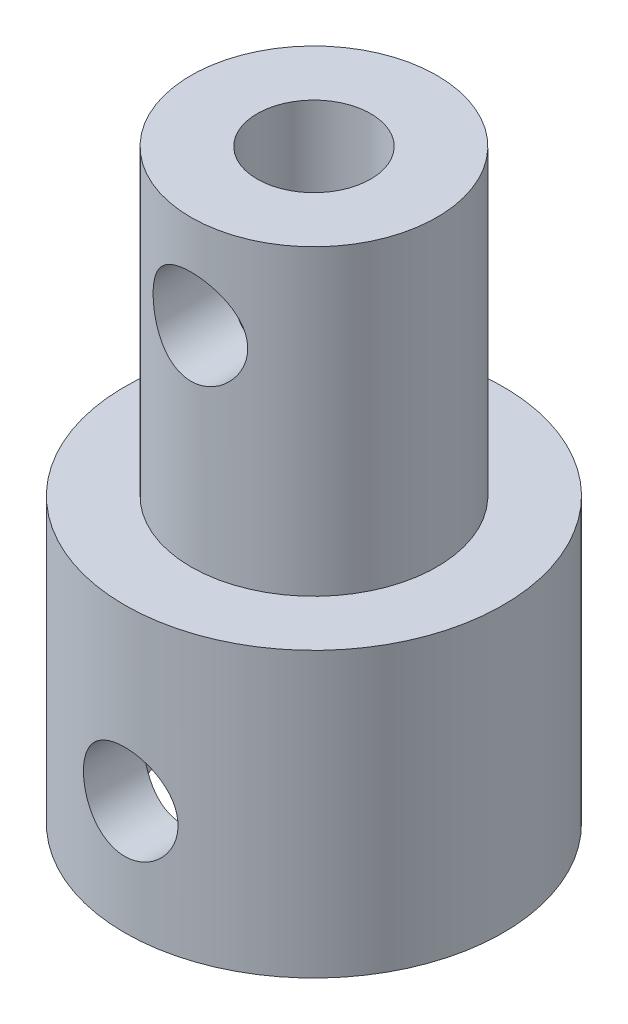
ISO-10303-21;
HEADER;
FILE_DESCRIPTION(('STEP AP214'),'2;1');
FILE_NAME('part.step','',(''),(''),'','','');
FILE_SCHEMA(('AUTOMOTIVE_DESIGN { 1 0 10303 214 1 1 1 1 }'));
ENDSEC;
DATA;
#1=APPLICATION_CONTEXT('core data for automotive mechanical design processes');
#2=APPLICATION_PROTOCOL_DEFINITION('international standard','automotive_design',2000,#1);
#3=PRODUCT_CONTEXT('',#1,'mechanical');
#4=PRODUCT('Part','Part','',(#3));
#5=PRODUCT_RELATED_PRODUCT_CATEGORY('part','',(#4));
#6=PRODUCT_DEFINITION_FORMATION('','',#4);
#7=PRODUCT_DEFINITION_CONTEXT('part definition',#1,'design');
#8=PRODUCT_DEFINITION('design','',#6,#7);
#9=PRODUCT_DEFINITION_SHAPE('','',#8);
#10=(LENGTH_UNIT() NAMED_UNIT(*) SI_UNIT(.MILLI.,.METRE.));
#11=(NAMED_UNIT(*) PLANE_ANGLE_UNIT() SI_UNIT($,.RADIAN.));
#12=(NAMED_UNIT(*) SI_UNIT($,.STERADIAN.) SOLID_ANGLE_UNIT());
#13=UNCERTAINTY_MEASURE_WITH_UNIT(LENGTH_MEASURE(1.E-05),#10,'distance_accuracy_value','');
#14=(GEOMETRIC_REPRESENTATION_CONTEXT(3) GLOBAL_UNCERTAINTY_ASSIGNED_CONTEXT((#13)) GLOBAL_UNIT_ASSIGNED_CONTEXT((#10,
#11,#12)) REPRESENTATION_CONTEXT('',''));
#15=CARTESIAN_POINT('',(0.,0.,0.));
#16=DIRECTION('',(0.,0.,1.));
#17=DIRECTION('',(1.,0.,0.));
#18=AXIS2_PLACEMENT_3D('',#15,#16,#17);
#19=CARTESIAN_POINT('',(0.,39.5299075629112,0.));
#20=DIRECTION('',(0.,1.,0.));
#21=DIRECTION('',(0.,0.,1.));
#22=AXIS2_PLACEMENT_3D('',#19,#20,#21);
#23=CYLINDRICAL_SURFACE('',#22,6.5);
#24=CARTESIAN_POINT('',(0.,23.5,6.5));
#25=CARTESIAN_POINT('',(0.13514306397447,23.4999939273656,6.50000462986299));
#26=CARTESIAN_POINT('',(0.270245683690177,23.5109920103322,6.49574921829707));
#27=CARTESIAN_POINT('',(0.536399893676354,23.5545046796923,6.47920060501405));
#28=CARTESIAN_POINT('',(0.667452289329329,23.5870149592184,6.46690901219325));
#29=CARTESIAN_POINT('',(0.921628003225198,23.6722230931575,6.43560329326637));
#30=CARTESIAN_POINT('',(1.04476653465277,23.7248807736205,6.41660255099367));
#31=CARTESIAN_POINT('',(1.2804490890132,23.8486790867224,6.3737599269311));
#32=CARTESIAN_POINT('',(1.39299010958969,23.919824935867,6.34991667922571));
#33=CARTESIAN_POINT('',(1.60927258674543,24.0818695715037,6.29865787982818));
#34=CARTESIAN_POINT('',(1.71248272971103,24.1734440616638,6.27113765392606));
#35=CARTESIAN_POINT('',(1.90251373412528,24.3723120888079,6.21612788263757));
#36=CARTESIAN_POINT('',(1.98932919333356,24.4796107864902,6.18863835032093));
#37=CARTESIAN_POINT('',(2.1475734167864,24.7121749791886,6.13556746669897));
#38=CARTESIAN_POINT('',(2.21823663101441,24.8379921285933,6.11010848455125));
#39=CARTESIAN_POINT('',(2.33716189177336,25.1008566598219,6.06561918541038));
#40=CARTESIAN_POINT('',(2.38543341568331,25.2378992614743,6.04658614953798));
#41=CARTESIAN_POINT('',(2.45608262902036,25.513196736226,6.01822730812514));
#42=CARTESIAN_POINT('',(2.47947801200991,25.6511499533078,6.00852169181304));
#43=CARTESIAN_POINT('',(2.50289199475193,25.929339459977,5.99880894830526));
#44=CARTESIAN_POINT('',(2.50292090442515,26.0695747153534,5.99879754376073));
#45=CARTESIAN_POINT('',(2.48037656312943,26.3388642581518,6.00814837573631));
#46=CARTESIAN_POINT('',(2.45923795706445,26.4680632129148,6.01691562933088));
#47=CARTESIAN_POINT('',(2.39733806133433,26.7209150794066,6.04184340382832));
#48=CARTESIAN_POINT('',(2.35657365742926,26.8445671075386,6.05800509806771));
#49=CARTESIAN_POINT('',(2.25582663922901,27.0856583117823,6.09624370169108));
#50=CARTESIAN_POINT('',(2.19548450476653,27.2029291522169,6.1184298919496));
#51=CARTESIAN_POINT('',(2.05754611602823,27.4260878785016,6.16618367671209));
#52=CARTESIAN_POINT('',(1.97994369235949,27.5319716741229,6.19175247894498));
#53=CARTESIAN_POINT('',(1.80320515332932,27.7372591612457,6.24560345180462));
#54=CARTESIAN_POINT('',(1.70293144449403,27.83566921961,6.27394938839792));
#55=CARTESIAN_POINT('',(1.48698639045576,28.0145806692834,6.32860686825818));
#56=CARTESIAN_POINT('',(1.37131243202998,28.0950790150006,6.35491806505566));
#57=CARTESIAN_POINT('',(1.12520910755081,28.2370550482149,6.40311406732309));
#58=CARTESIAN_POINT('',(0.994562099156593,28.2981856575932,6.42491590699446));
#59=CARTESIAN_POINT('',(0.723789666413503,28.3972661025489,6.46101701436));
#60=CARTESIAN_POINT('',(0.583668713964962,28.4352267911306,6.47531979423949));
#61=CARTESIAN_POINT('',(0.306275874042355,28.4849421817623,6.49418523125042));
#62=CARTESIAN_POINT('',(0.169277177253719,28.4980338789584,6.49924422048433));
#63=CARTESIAN_POINT('',(-0.105038056069671,28.5015534380367,6.50059706095231));
#64=CARTESIAN_POINT('',(-0.242354510117281,28.491986638772,6.49689297696437));
#65=CARTESIAN_POINT('',(-0.507523391484589,28.4514649156598,6.48146252652959));
#66=CARTESIAN_POINT('',(-0.635533278632624,28.4213996939687,6.47007006377642));
#67=CARTESIAN_POINT('',(-0.884591112419541,28.3419207694987,6.44074795216429));
#68=CARTESIAN_POINT('',(-1.00563815383339,28.2925045574291,6.42281745552311));
#69=CARTESIAN_POINT('',(-1.24139762727352,28.1741323847667,6.38151162872812));
#70=CARTESIAN_POINT('',(-1.35581229097728,28.1046361856224,6.35798948099243));
#71=CARTESIAN_POINT('',(-1.57174720946057,27.9486828718725,6.30808313000719));
#72=CARTESIAN_POINT('',(-1.67326251243973,27.8622192760433,6.28169783481671));
#73=CARTESIAN_POINT('',(-1.86700866345895,27.6685802493167,6.22695982329862));
#74=CARTESIAN_POINT('',(-1.95829399903938,27.5604624610308,6.19858535620119));
#75=CARTESIAN_POINT('',(-2.12162980756564,27.329904597358,6.14459987855306));
#76=CARTESIAN_POINT('',(-2.19367804771027,27.2074628617964,6.11898918899244));
#77=CARTESIAN_POINT('',(-2.31670165885943,26.950423952603,6.07348698871133));
#78=CARTESIAN_POINT('',(-2.3675457507259,26.8157571607653,6.05363133271636));
#79=CARTESIAN_POINT('',(-2.44547862786551,26.5387893944966,6.02257652756719));
#80=CARTESIAN_POINT('',(-2.47258316364822,26.39649354834,6.01137163946424));
#81=CARTESIAN_POINT('',(-2.50082210532946,26.1186113991318,5.99967502686126));
#82=CARTESIAN_POINT('',(-2.50357962943262,25.9832169809304,5.99851384313484));
#83=CARTESIAN_POINT('',(-2.48724412852083,25.7139989075653,6.00530547478505));
#84=CARTESIAN_POINT('',(-2.4681534084365,25.5801750882123,6.01325732876099));
#85=CARTESIAN_POINT('',(-2.40995136741684,25.3225039371973,6.03680892276013));
#86=CARTESIAN_POINT('',(-2.37153828396776,25.1984722976881,6.05214118297217));
#87=CARTESIAN_POINT('',(-2.27641115159597,24.9585502065407,6.08855756315716));
#88=CARTESIAN_POINT('',(-2.21969236739861,24.8426618708484,6.10964317117389));
#89=CARTESIAN_POINT('',(-2.08599319505101,24.6154646964258,6.15661478314378));
#90=CARTESIAN_POINT('',(-2.00807939428014,24.5047467585243,6.18269935662048));
#91=CARTESIAN_POINT('',(-1.83561573990325,24.297440282091,6.23607706100414));
#92=CARTESIAN_POINT('',(-1.74106046198838,24.2008563694186,6.2633705837922));
#93=CARTESIAN_POINT('',(-1.53143830219016,24.018824624031,6.31799605166972));
#94=CARTESIAN_POINT('',(-1.41549882935314,23.9343499410604,6.34523808084888));
#95=CARTESIAN_POINT('',(-1.17010716237062,23.7860891403572,6.39503827616325));
#96=CARTESIAN_POINT('',(-1.04065270472818,23.7223064955093,6.41759565581366));
#97=CARTESIAN_POINT('',(-0.762900842232426,23.6142955809813,6.4566913943766));
#98=CARTESIAN_POINT('',(-0.613925037531382,23.571615623945,6.47274070554298));
#99=CARTESIAN_POINT('',(-0.309946097844234,23.5144793950754,6.49438936244195));
#100=CARTESIAN_POINT('',(-0.154946466000343,23.5000069624975,6.49999469169273));
#101=CARTESIAN_POINT('',(0.,23.5,6.5));
#102=B_SPLINE_CURVE_WITH_KNOTS('',3,(#24,#25,#26,#27,#28,#29,#30,#31,#32,#33,#34,#35,#36,#37,
#38,#39,#40,#41,#42,#43,#44,#45,#46,#47,#48,#49,#50,#51,#52,#53,#54,#55,#56,#57,#58,#59,#60,#61,
#62,#63,#64,#65,#66,#67,#68,#69,#70,#71,#72,#73,#74,#75,#76,#77,#78,#79,#80,#81,#82,#83,#84,#85,
#86,#87,#88,#89,#90,#91,#92,#93,#94,#95,#96,#97,#98,#99,#100,#101),.UNSPECIFIED.,.T.,.F.,(4,2,2,
2,2,2,2,2,2,2,2,2,2,2,2,2,2,2,2,2,2,2,2,2,2,2,2,2,2,2,2,2,2,2,2,2,2,2,4),(0.,0.404857395673176,
0.809633761045265,1.21360717298343,1.61769469151935,2.03792903302865,2.45830160597867,
2.89569907712732,3.33291124861788,3.75145366078395,4.1698114006033,4.5616122308849,
4.95347525299001,5.35298551114874,5.75263879750162,6.18066348321892,6.60876089197113,
7.04414506400743,7.47932514126755,7.89036278979611,8.30130359821625,8.69545686414668,
9.08966125783836,9.49565660960558,9.90180734683232,10.3327599285418,10.7637625081092,
11.1973952581664,11.6307400870074,12.0349578310578,12.4391329351611,12.8296520191847,
13.2202722028207,13.6321153154032,14.0440929181879,14.480008517899,14.9159972424678,
15.3804472276237,15.8446310403091),.UNSPECIFIED.);
#103=CARTESIAN_POINT('',(0.,23.5,6.5));
#104=VERTEX_POINT('',#103);
#105=EDGE_CURVE('E79',#104,#104,#102,.T.);
#106=ORIENTED_EDGE('',*,*,#105,.F.);
#107=EDGE_LOOP('',(#106));
#108=FACE_BOUND('',#107,.T.);
#109=CARTESIAN_POINT('',(0.,15.,0.));
#110=DIRECTION('',(0.,1.,0.));
#111=DIRECTION('',(0.,0.,1.));
#112=AXIS2_PLACEMENT_3D('',#109,#110,#111);
#113=CIRCLE('',#112,6.5);
#114=CARTESIAN_POINT('',(0.,15.,6.5));
#115=VERTEX_POINT('',#114);
#116=EDGE_CURVE('E69',#115,#115,#113,.T.);
#117=ORIENTED_EDGE('',*,*,#116,.T.);
#118=EDGE_LOOP('',(#117));
#119=FACE_BOUND('',#118,.T.);
#120=CARTESIAN_POINT('',(0.,31.,0.));
#121=DIRECTION('',(0.,1.,0.));
#122=DIRECTION('',(0.,0.,1.));
#123=AXIS2_PLACEMENT_3D('',#120,#121,#122);
#124=CIRCLE('',#123,6.5);
#125=CARTESIAN_POINT('',(0.,31.,6.5));
#126=VERTEX_POINT('',#125);
#127=EDGE_CURVE('E10',#126,#126,#124,.T.);
#128=ORIENTED_EDGE('',*,*,#127,.F.);
#129=EDGE_LOOP('',(#128));
#130=FACE_BOUND('',#129,.T.);
#131=ADVANCED_FACE('F42',(#108,#119,#130),#23,.T.);
#132=CARTESIAN_POINT('',(-6.5,31.,0.));
#133=DIRECTION('',(0.,1.,0.));
#134=DIRECTION('',(0.,0.,1.));
#135=AXIS2_PLACEMENT_3D('',#132,#133,#134);
#136=PLANE('',#135);
#137=ORIENTED_EDGE('',*,*,#127,.T.);
#138=EDGE_LOOP('',(#137));
#139=FACE_BOUND('',#138,.T.);
#140=CARTESIAN_POINT('',(0.,31.,0.));
#141=DIRECTION('',(0.,1.,0.));
#142=DIRECTION('',(0.,0.,1.));
#143=AXIS2_PLACEMENT_3D('',#140,#141,#142);
#144=CIRCLE('',#143,3.);
#145=CARTESIAN_POINT('',(0.,31.,3.));
#146=VERTEX_POINT('',#145);
#147=EDGE_CURVE('E56',#146,#146,#144,.T.);
#148=ORIENTED_EDGE('',*,*,#147,.F.);
#149=EDGE_LOOP('',(#148));
#150=FACE_BOUND('',#149,.T.);
#151=ADVANCED_FACE('F135',(#139,#150),#136,.T.);
#152=CARTESIAN_POINT('',(0.,39.5299075629112,0.));
#153=DIRECTION('',(0.,1.,0.));
#154=DIRECTION('',(0.,0.,1.));
#155=AXIS2_PLACEMENT_3D('',#152,#153,#154);
#156=CYLINDRICAL_SURFACE('',#155,3.);
#157=CARTESIAN_POINT('',(0.,23.5,3.));
#158=CARTESIAN_POINT('',(-0.118757533193203,23.5000048855537,2.99999522795205));
#159=CARTESIAN_POINT('',(-0.237551281104127,23.5085225039046,2.99288670594742));
#160=CARTESIAN_POINT('',(-0.47118249249281,23.5419627233518,2.96510762868268));
#161=CARTESIAN_POINT('',(-0.586016959612416,23.5668974739753,2.94442702942008));
#162=CARTESIAN_POINT('',(-0.807829942407295,23.6313121173327,2.89142690238865));
#163=CARTESIAN_POINT('',(-0.9148509209049,23.6707050743537,2.8591769655007));
#164=CARTESIAN_POINT('',(-1.11984139043408,23.7620170479426,2.78529176182903));
#165=CARTESIAN_POINT('',(-1.21780780775233,23.8139402966733,2.74365332434937));
#166=CARTESIAN_POINT('',(-1.43789998519766,23.9494537498082,2.63674191529867));
#167=CARTESIAN_POINT('',(-1.5556821965722,24.0376702041822,2.56840549256191));
#168=CARTESIAN_POINT('',(-1.77202398328146,24.2305243257514,2.42422624777674));
#169=CARTESIAN_POINT('',(-1.87052845158604,24.3352075692431,2.34836281453277));
#170=CARTESIAN_POINT('',(-2.00437263805588,24.5040842764911,2.23294886313739));
#171=CARTESIAN_POINT('',(-2.04699726278815,24.5629555761913,2.19383679994998));
#172=CARTESIAN_POINT('',(-2.12715295529554,24.6845056029605,2.11620611809194));
#173=CARTESIAN_POINT('',(-2.16468231743739,24.7471855948707,2.07768770195023));
#174=CARTESIAN_POINT('',(-2.23441122570746,24.8762673243356,2.00250543288662));
#175=CARTESIAN_POINT('',(-2.26662332666226,24.9426597847248,1.96583735754651));
#176=CARTESIAN_POINT('',(-2.32553690612792,25.0794462839284,1.89577686630312));
#177=CARTESIAN_POINT('',(-2.35224307998679,25.1498368473418,1.86238167220905));
#178=CARTESIAN_POINT('',(-2.40193513934005,25.3016670902001,1.79791918980413));
#179=CARTESIAN_POINT('',(-2.42433807692597,25.3835240927235,1.76736311251004));
#180=CARTESIAN_POINT('',(-2.46101313675501,25.5518897688131,1.71593180556004));
#181=CARTESIAN_POINT('',(-2.47530499393792,25.6383865866147,1.69503310194198));
#182=CARTESIAN_POINT('',(-2.49481072799047,25.8157654083795,1.66620928968845));
#183=CARTESIAN_POINT('',(-2.49991205058667,25.9066879590707,1.65844510563094));
#184=CARTESIAN_POINT('',(-2.50008569371189,26.0885626130028,1.65818308531826));
#185=CARTESIAN_POINT('',(-2.49515788278404,26.1795147166153,1.66568544916941));
#186=CARTESIAN_POINT('',(-2.47505262029593,26.3655247108271,1.69541639464499));
#187=CARTESIAN_POINT('',(-2.45905577113331,26.4602937457171,1.71881932066468));
#188=CARTESIAN_POINT('',(-2.41742550503026,26.6442109812022,1.77688235738915));
#189=CARTESIAN_POINT('',(-2.39176011044289,26.7333393707148,1.81157977103026));
#190=CARTESIAN_POINT('',(-2.33816270346872,26.8878270785411,1.88002226126139));
#191=CARTESIAN_POINT('',(-2.31177513033565,26.9543122424117,1.9125031684544));
#192=CARTESIAN_POINT('',(-2.25404424958635,27.0836508067799,1.98021996661531));
#193=CARTESIAN_POINT('',(-2.22269803586305,27.1465020478658,2.01545746697787));
#194=CARTESIAN_POINT('',(-2.12149677560464,27.3299668410197,2.12342648109726));
#195=CARTESIAN_POINT('',(-2.04450664231775,27.4454141476061,2.19837696967439));
#196=CARTESIAN_POINT('',(-1.86765914501413,27.6682669624544,2.35079897952279));
#197=CARTESIAN_POINT('',(-1.76681805277627,27.7749383239919,2.42819792618946));
#198=CARTESIAN_POINT('',(-1.54484388336147,27.9711123448174,2.57509054043286));
#199=CARTESIAN_POINT('',(-1.42375565615771,28.0606520330563,2.64460112267365));
#200=CARTESIAN_POINT('',(-1.19411179169414,28.1994148390986,2.75428914126548));
#201=CARTESIAN_POINT('',(-1.08972732107275,28.2531428981877,2.79748350073996));
#202=CARTESIAN_POINT('',(-0.871071458330348,28.3463427452553,2.87307804019802));
#203=CARTESIAN_POINT('',(-0.756806292780745,28.3858234315806,2.90548495660805));
#204=CARTESIAN_POINT('',(-0.519954301215402,28.4484172499322,2.95709834265566));
#205=CARTESIAN_POINT('',(-0.397310923125291,28.4714039466575,2.97620280955845));
#206=CARTESIAN_POINT('',(-0.148559976923712,28.4987092319272,2.99891434528972));
#207=CARTESIAN_POINT('',(-0.0224547835239879,28.5030403108502,3.00253178304177));
#208=CARTESIAN_POINT('',(0.213310199456587,28.4933375605562,2.99444999039147));
#209=CARTESIAN_POINT('',(0.323130540835871,28.4814413612848,2.98453350716313));
#210=CARTESIAN_POINT('',(0.538644964400616,28.4437330497885,2.95325589460135));
#211=CARTESIAN_POINT('',(0.644338549989572,28.417919268281,2.93189339242796));
#212=CARTESIAN_POINT('',(0.850565499199265,28.3533766045447,2.87889521546186));
#213=CARTESIAN_POINT('',(0.951010682223324,28.3144792105557,2.84712564891974));
#214=CARTESIAN_POINT('',(1.14365900898104,28.2256043676633,2.77536124733889));
#215=CARTESIAN_POINT('',(1.23585908831211,28.1756228230067,2.73536337221808));
#216=CARTESIAN_POINT('',(1.450674397351,28.041568204653,2.62975152158594));
#217=CARTESIAN_POINT('',(1.56834359540731,27.9522674167327,2.56070244234714));
#218=CARTESIAN_POINT('',(1.78428994740848,27.7571596173443,2.4152244540319));
#219=CARTESIAN_POINT('',(1.88250490855173,27.6513015446452,2.33877300422834));
#220=CARTESIAN_POINT('',(2.01573314784291,27.4805880320714,2.222698055986));
#221=CARTESIAN_POINT('',(2.05811069143949,27.421101727024,2.1834115173603));
#222=CARTESIAN_POINT('',(2.13771669597406,27.2982791839677,2.10553153817181));
#223=CARTESIAN_POINT('',(2.17494330406755,27.2349415723359,2.06693835133607));
#224=CARTESIAN_POINT('',(2.24398857026758,27.1045115960848,1.99176108482639));
#225=CARTESIAN_POINT('',(2.27582148781538,27.0374297754664,1.95517188634212));
#226=CARTESIAN_POINT('',(2.3338885673946,26.8992098955001,1.88547561448179));
#227=CARTESIAN_POINT('',(2.36012785984655,26.8280756295806,1.8523653645079));
#228=CARTESIAN_POINT('',(2.40837357148322,26.6757296316481,1.78925557416047));
#229=CARTESIAN_POINT('',(2.42988314318544,26.5941655489263,1.75970711786654));
#230=CARTESIAN_POINT('',(2.46482255689514,26.4265480460574,1.71043063887427));
#231=CARTESIAN_POINT('',(2.47827257713356,26.3405064286721,1.6906781122526));
#232=CARTESIAN_POINT('',(2.49617289535263,26.1643623925876,1.66415315979461));
#233=CARTESIAN_POINT('',(2.5005179918396,26.0742246702493,1.65753251048392));
#234=CARTESIAN_POINT('',(2.49938197104455,25.894146787216,1.65924308630668));
#235=CARTESIAN_POINT('',(2.49389826274011,25.8042066848748,1.66757825402156));
#236=CARTESIAN_POINT('',(2.4726526384854,25.6183274246095,1.69892898735521));
#237=CARTESIAN_POINT('',(2.4558581255076,25.5227697294673,1.72341371023859));
#238=CARTESIAN_POINT('',(2.4125033967509,25.3374687039173,1.78358728037389));
#239=CARTESIAN_POINT('',(2.38591088285908,25.2477457712907,1.81931312531328));
#240=CARTESIAN_POINT('',(2.33050835844917,25.0922109586451,1.88952619366196));
#241=CARTESIAN_POINT('',(2.3032585304953,25.0252562407651,1.92277816627793));
#242=CARTESIAN_POINT('',(2.24370627018011,24.8950536135756,1.99195185230572));
#243=CARTESIAN_POINT('',(2.21140090020862,24.8318078890002,2.02787511150522));
#244=CARTESIAN_POINT('',(2.10716294428983,24.647270438658,2.13775931167915));
#245=CARTESIAN_POINT('',(2.02793576743749,24.531253075008,2.21379780164322));
#246=CARTESIAN_POINT('',(1.84629697567411,24.3079927387087,2.36772603763548));
#247=CARTESIAN_POINT('',(1.74293959593278,24.2014582059671,2.44552394429515));
#248=CARTESIAN_POINT('',(1.51553554935618,24.0061362004606,2.59256498427756));
#249=CARTESIAN_POINT('',(1.39153583663212,23.917309434126,2.66182692543069));
#250=CARTESIAN_POINT('',(1.1585551814108,23.7816858032769,2.7694230578151));
#251=CARTESIAN_POINT('',(1.0539987794769,23.7299614897805,2.81112174006884));
#252=CARTESIAN_POINT('',(0.835439786054324,23.6407813297614,2.88361460666454));
#253=CARTESIAN_POINT('',(0.72145002675387,23.6033064759047,2.91442331323771));
#254=CARTESIAN_POINT('',(0.506620038886829,23.5498115441734,2.95858745904691));
#255=CARTESIAN_POINT('',(0.4068454687619,23.5312248777732,2.97402142398111));
#256=CARTESIAN_POINT('',(0.204722725654225,23.5063176317619,2.99472922794408));
#257=CARTESIAN_POINT('',(0.102374818922778,23.4999957884131,3.00000411373941));
#258=CARTESIAN_POINT('',(0.,23.5,3.));
#259=B_SPLINE_CURVE_WITH_KNOTS('',3,(#157,#158,#159,#160,#161,#162,#163,#164,#165,#166,#167,
#168,#169,#170,#171,#172,#173,#174,#175,#176,#177,#178,#179,#180,#181,#182,#183,#184,#185,#186,
#187,#188,#189,#190,#191,#192,#193,#194,#195,#196,#197,#198,#199,#200,#201,#202,#203,#204,#205,
#206,#207,#208,#209,#210,#211,#212,#213,#214,#215,#216,#217,#218,#219,#220,#221,#222,#223,#224,
#225,#226,#227,#228,#229,#230,#231,#232,#233,#234,#235,#236,#237,#238,#239,#240,#241,#242,#243,
#244,#245,#246,#247,#248,#249,#250,#251,#252,#253,#254,#255,#256,#257,#258),.UNSPECIFIED.,.T.,
.F.,(4,2,2,2,2,2,2,2,2,2,2,2,2,2,2,2,2,2,2,2,2,2,2,2,2,2,2,2,2,2,2,2,2,2,2,2,2,2,2,2,2,2,2,2,2,
2,2,2,2,2,4),(0.,0.355841276815112,0.711946191026959,1.0659440535955,1.42006164830115,
1.90425178760126,2.38980643116774,2.63722280423448,2.88472179650724,3.13162777943675,
3.37832232674673,3.64812890035753,3.91727616616868,4.18969776924974,4.46212294312046,
4.75723524199721,5.05333228584568,5.28870178855694,5.52420974868633,5.9954933935898,
6.49137310548271,6.98616858956867,7.36002155957575,7.73364063000475,8.1100939531972,
8.4862951927436,8.81743460677925,9.1486137466987,9.48423297747605,9.81997643164432,
10.3065635514456,10.7946819775667,11.0432812121088,11.2919696391639,11.5399899810636,
11.787781852862,12.0551105531685,12.3217671309317,12.5914881373799,12.8612802568451,
13.1598101383752,13.4593330283461,13.6977271411687,13.9362602949129,14.4135864576438,
14.914300110886,15.413889999571,15.7841228897598,16.1538601797496,16.4606444271243,
16.7673970625123),.UNSPECIFIED.);
#260=CARTESIAN_POINT('',(0.,23.5,3.));
#261=VERTEX_POINT('',#260);
#262=EDGE_CURVE('E71',#261,#261,#259,.T.);
#263=ORIENTED_EDGE('',*,*,#262,.F.);
#264=EDGE_LOOP('',(#263));
#265=FACE_BOUND('',#264,.T.);
#266=CARTESIAN_POINT('',(0.,14.4034424761102,0.));
#267=DIRECTION('',(0.,-1.,0.));
#268=DIRECTION('',(0.,0.,-1.));
#269=AXIS2_PLACEMENT_3D('',#266,#267,#268);
#270=CIRCLE('',#269,3.);
#271=CARTESIAN_POINT('',(0.,14.4034424761102,-3.));
#272=VERTEX_POINT('',#271);
#273=EDGE_CURVE('E66',#272,#272,#270,.F.);
#274=ORIENTED_EDGE('',*,*,#273,.F.);
#275=EDGE_LOOP('',(#274));
#276=FACE_BOUND('',#275,.T.);
#277=ORIENTED_EDGE('',*,*,#147,.T.);
#278=EDGE_LOOP('',(#277));
#279=FACE_BOUND('',#278,.T.);
#280=ADVANCED_FACE('F81',(#265,#276,#279),#156,.F.);
#281=CARTESIAN_POINT('',(-3.,0.,0.));
#282=DIRECTION('',(0.,-1.,0.));
#283=DIRECTION('',(0.,0.,-1.));
#284=AXIS2_PLACEMENT_3D('',#281,#282,#283);
#285=PLANE('',#284);
#286=CARTESIAN_POINT('',(0.,0.,0.));
#287=DIRECTION('',(0.,-1.,0.));
#288=DIRECTION('',(0.,0.,-1.));
#289=AXIS2_PLACEMENT_3D('',#286,#287,#288);
#290=CIRCLE('',#289,7.);
#291=CARTESIAN_POINT('',(0.,0.,-7.));
#292=VERTEX_POINT('',#291);
#293=EDGE_CURVE('E102',#292,#292,#290,.T.);
#294=ORIENTED_EDGE('',*,*,#293,.F.);
#295=EDGE_LOOP('',(#294));
#296=FACE_BOUND('',#295,.T.);
#297=CARTESIAN_POINT('',(0.,0.,0.));
#298=DIRECTION('',(0.,1.,0.));
#299=DIRECTION('',(0.,0.,1.));
#300=AXIS2_PLACEMENT_3D('',#297,#298,#299);
#301=CIRCLE('',#300,9.99999999999999);
#302=CARTESIAN_POINT('',(0.,0.,9.99999999999999));
#303=VERTEX_POINT('',#302);
#304=EDGE_CURVE('E62',#303,#303,#301,.T.);
#305=ORIENTED_EDGE('',*,*,#304,.F.);
#306=EDGE_LOOP('',(#305));
#307=FACE_BOUND('',#306,.T.);
#308=ADVANCED_FACE('F126',(#296,#307),#285,.T.);
#309=CARTESIAN_POINT('',(0.,39.5299075629112,0.));
#310=DIRECTION('',(0.,1.,0.));
#311=DIRECTION('',(0.,0.,1.));
#312=AXIS2_PLACEMENT_3D('',#309,#310,#311);
#313=CYLINDRICAL_SURFACE('',#312,9.99999999999999);
#314=CARTESIAN_POINT('',(0.,3.5,9.99999999999999));
#315=CARTESIAN_POINT('',(0.138126814449551,3.50000387623027,9.99999766446687));
#316=CARTESIAN_POINT('',(0.276296929717938,3.51148591795632,9.99710963553043));
#317=CARTESIAN_POINT('',(0.54867720628422,3.55704191884502,9.98586856383157));
#318=CARTESIAN_POINT('',(0.682885078117897,3.59112868256309,9.97751242366626));
#319=CARTESIAN_POINT('',(0.943368120304292,3.68073208910348,9.9562604388672));
#320=CARTESIAN_POINT('',(1.06965260571667,3.73622299785879,9.94337004736763));
#321=CARTESIAN_POINT('',(1.31112021984071,3.86696898340808,9.91442239679369));
#322=CARTESIAN_POINT('',(1.4263029739146,3.94222472686495,9.8983650309026));
#323=CARTESIAN_POINT('',(1.64466987883486,4.11200131609031,9.86445689319488));
#324=CARTESIAN_POINT('',(1.74759281676842,4.20685262493177,9.84657845246876));
#325=CARTESIAN_POINT('',(1.93624821200553,4.41242034151506,9.8112270019656));
#326=CARTESIAN_POINT('',(2.02197872824865,4.5231385382449,9.79375403816446));
#327=CARTESIAN_POINT('',(2.17504423799829,4.75932537789499,9.7609129283028));
#328=CARTESIAN_POINT('',(2.24208702654189,4.88498871801455,9.74557990774684));
#329=CARTESIAN_POINT('',(2.35399484758457,5.14624735276673,9.71915824696693));
#330=CARTESIAN_POINT('',(2.39886342573356,5.28184105555336,9.7080689282403));
#331=CARTESIAN_POINT('',(2.46425806134127,5.55623916366944,9.69167461160538));
#332=CARTESIAN_POINT('',(2.48525378055342,5.69492482672999,9.68625818328352));
#333=CARTESIAN_POINT('',(2.50376962511067,5.97394761499891,9.68148937432652));
#334=CARTESIAN_POINT('',(2.50129356969685,6.11428446782023,9.68213600713214));
#335=CARTESIAN_POINT('',(2.4733108743995,6.38902634624226,9.68932009194694));
#336=CARTESIAN_POINT('',(2.44836390031772,6.52349270244222,9.69571438345489));
#337=CARTESIAN_POINT('',(2.37704031150498,6.7862684181851,9.71344516118448));
#338=CARTESIAN_POINT('',(2.33066217011565,6.91457733838153,9.72478199948731));
#339=CARTESIAN_POINT('',(2.21731579656197,7.16289669375355,9.75125189842765));
#340=CARTESIAN_POINT('',(2.15014444538819,7.28281028631595,9.76642212449693));
#341=CARTESIAN_POINT('',(1.9972604600249,7.50986451626136,9.79882851409984));
#342=CARTESIAN_POINT('',(1.91154458134805,7.61700291344541,9.81606503891046));
#343=CARTESIAN_POINT('',(1.72110570780203,7.818672692824,9.85126467566485));
#344=CARTESIAN_POINT('',(1.61591043027643,7.91275748343558,9.86923449130001));
#345=CARTESIAN_POINT('',(1.39101986250616,8.0820354041065,9.90343275964593));
#346=CARTESIAN_POINT('',(1.27132412951324,8.15722795710594,9.91966115915679));
#347=CARTESIAN_POINT('',(1.02019314780232,8.28675097704064,9.9486288682365));
#348=CARTESIAN_POINT('',(0.888718988681035,8.34100890042404,9.96135600212878));
#349=CARTESIAN_POINT('',(0.618126680238135,8.42652884284928,9.9817986165236));
#350=CARTESIAN_POINT('',(0.479009998584139,8.45779526069689,9.98951505565467));
#351=CARTESIAN_POINT('',(0.200899950650043,8.49576260926472,9.99892498785624));
#352=CARTESIAN_POINT('',(0.061994533313682,8.5030717101255,10.0007675584713));
#353=CARTESIAN_POINT('',(-0.215054791335848,8.49458499657418,9.99864674690754));
#354=CARTESIAN_POINT('',(-0.353198766074327,8.47879126200143,9.99468388736421));
#355=CARTESIAN_POINT('',(-0.622690447960816,8.42504848601437,9.98149301878918));
#356=CARTESIAN_POINT('',(-0.754108531614582,8.38743122753837,9.97234390309646));
#357=CARTESIAN_POINT('',(-1.00876215408752,8.29148819328589,9.94981177723595));
#358=CARTESIAN_POINT('',(-1.13199686505442,8.23316032614463,9.93642833949965));
#359=CARTESIAN_POINT('',(-1.36920522404971,8.0962731185422,9.9065551321037));
#360=CARTESIAN_POINT('',(-1.48297573639294,8.01737314600572,9.89001445610999));
#361=CARTESIAN_POINT('',(-1.69587768940551,7.84201681867138,9.85574181979586));
#362=CARTESIAN_POINT('',(-1.79500659828874,7.74555743397058,9.83800965421577));
#363=CARTESIAN_POINT('',(-1.97831761345414,7.53499673192715,9.80281594932497));
#364=CARTESIAN_POINT('',(-2.06207311270183,7.42052049500073,9.78537173637463));
#365=CARTESIAN_POINT('',(-2.20918459835604,7.17877894255236,9.75321463970069));
#366=CARTESIAN_POINT('',(-2.272541490269,7.05151419504926,9.7385016347494));
#367=CARTESIAN_POINT('',(-2.37658570101223,6.78849046265627,9.71363491194664));
#368=CARTESIAN_POINT('',(-2.4174073277393,6.65278728614617,9.70345425375808));
#369=CARTESIAN_POINT('',(-2.47557609990489,6.37615060357451,9.68877906706585));
#370=CARTESIAN_POINT('',(-2.49292837912652,6.23521824829758,9.68428329504044));
#371=CARTESIAN_POINT('',(-2.50339765056082,5.95646496023065,9.68158168701612));
#372=CARTESIAN_POINT('',(-2.49719649630131,5.81867094145592,9.68319887888034));
#373=CARTESIAN_POINT('',(-2.46229546385365,5.54616018555623,9.69213181672142));
#374=CARTESIAN_POINT('',(-2.43359603781098,5.41144338664468,9.69944744817731));
#375=CARTESIAN_POINT('',(-2.35488553240495,5.14965256822356,9.71885434473221));
#376=CARTESIAN_POINT('',(-2.30500234113403,5.02253782459945,9.73091692061056));
#377=CARTESIAN_POINT('',(-2.18544152267503,4.77839102881073,9.75846259540839));
#378=CARTESIAN_POINT('',(-2.11576115005695,4.66136037802186,9.77394616867808));
#379=CARTESIAN_POINT('',(-1.95644624772858,4.43740895166325,9.80709390439337));
#380=CARTESIAN_POINT('',(-1.86633860485376,4.33083154429339,9.82480441386302));
#381=CARTESIAN_POINT('',(-1.66964895198288,4.13408825867434,9.86013378743769));
#382=CARTESIAN_POINT('',(-1.56306303543524,4.04392628314506,9.87775262878422));
#383=CARTESIAN_POINT('',(-1.33411264450431,3.88098115239232,9.91129426079449));
#384=CARTESIAN_POINT('',(-1.21149737052731,3.80854231054737,9.92718055609783));
#385=CARTESIAN_POINT('',(-0.955443432517455,3.68542089509912,9.9550820829186));
#386=CARTESIAN_POINT('',(-0.822012605727895,3.63472273225245,9.96710008666301));
#387=CARTESIAN_POINT('',(-0.574017088739116,3.56404694945058,9.98413432609236));
#388=CARTESIAN_POINT('',(-0.460633618180111,3.54008126157762,9.99004308421151));
#389=CARTESIAN_POINT('',(-0.231510119227137,3.5080567606301,9.9979767538658));
#390=CARTESIAN_POINT('',(-0.115770268737693,3.49999675115784,10.0000019575149));
#391=CARTESIAN_POINT('',(0.,3.5,9.99999999999999));
#392=B_SPLINE_CURVE_WITH_KNOTS('',3,(#314,#315,#316,#317,#318,#319,#320,#321,#322,#323,#324,
#325,#326,#327,#328,#329,#330,#331,#332,#333,#334,#335,#336,#337,#338,#339,#340,#341,#342,#343,
#344,#345,#346,#347,#348,#349,#350,#351,#352,#353,#354,#355,#356,#357,#358,#359,#360,#361,#362,
#363,#364,#365,#366,#367,#368,#369,#370,#371,#372,#373,#374,#375,#376,#377,#378,#379,#380,#381,
#382,#383,#384,#385,#386,#387,#388,#389,#390,#391),.UNSPECIFIED.,.T.,.F.,(4,2,2,2,2,2,2,2,2,2,2,
2,2,2,2,2,2,2,2,2,2,2,2,2,2,2,2,2,2,2,2,2,2,2,2,2,2,2,4),(0.,0.413956187453148,
0.828147062939831,1.24184150381017,1.65554990028221,2.07690725728564,2.49831215966769,
2.92597745909677,3.3535743528228,3.77260491835115,4.19156730193362,4.6003749501723,
5.00921172448931,5.42217546461999,5.83521151399138,6.26002501620565,6.68485149269278,
7.11113715020723,7.53734122819937,7.95263848254326,8.36789835193437,8.77700457528928,
9.1861521220935,9.60255979281119,10.0190393835223,10.4457418201299,10.8724253125471,
11.2965375769763,11.7205570543047,12.1323963400748,12.5442273493652,12.9536066760887,
13.3630428023796,13.7831596069298,14.2033761629382,14.6312030917577,15.0587227304538,
15.4057040491337,15.7526592674819),.UNSPECIFIED.);
#393=CARTESIAN_POINT('',(0.,3.5,9.99999999999999));
#394=VERTEX_POINT('',#393);
#395=EDGE_CURVE('E80',#394,#394,#392,.T.);
#396=ORIENTED_EDGE('',*,*,#395,.F.);
#397=EDGE_LOOP('',(#396));
#398=FACE_BOUND('',#397,.T.);
#399=ORIENTED_EDGE('',*,*,#304,.T.);
#400=EDGE_LOOP('',(#399));
#401=FACE_BOUND('',#400,.T.);
#402=CARTESIAN_POINT('',(0.,15.,0.));
#403=DIRECTION('',(0.,1.,0.));
#404=DIRECTION('',(0.,0.,1.));
#405=AXIS2_PLACEMENT_3D('',#402,#403,#404);
#406=CIRCLE('',#405,10.);
#407=CARTESIAN_POINT('',(0.,15.,10.));
#408=VERTEX_POINT('',#407);
#409=EDGE_CURVE('E116',#408,#408,#406,.T.);
#410=ORIENTED_EDGE('',*,*,#409,.F.);
#411=EDGE_LOOP('',(#410));
#412=FACE_BOUND('',#411,.T.);
#413=ADVANCED_FACE('F123',(#398,#401,#412),#313,.T.);
#414=CARTESIAN_POINT('',(-6.5,15.,0.));
#415=DIRECTION('',(0.,1.,0.));
#416=DIRECTION('',(0.,0.,1.));
#417=AXIS2_PLACEMENT_3D('',#414,#415,#416);
#418=PLANE('',#417);
#419=ORIENTED_EDGE('',*,*,#409,.T.);
#420=EDGE_LOOP('',(#419));
#421=FACE_BOUND('',#420,.T.);
#422=ORIENTED_EDGE('',*,*,#116,.F.);
#423=EDGE_LOOP('',(#422));
#424=FACE_BOUND('',#423,.T.);
#425=ADVANCED_FACE('F133',(#421,#424),#418,.T.);
#426=CARTESIAN_POINT('',(0.,12.,0.));
#427=DIRECTION('',(0.,-1.,0.));
#428=DIRECTION('',(0.,0.,-1.));
#429=AXIS2_PLACEMENT_3D('',#426,#427,#428);
#430=CONICAL_SURFACE('',#429,7.,1.02974425867665);
#431=ORIENTED_EDGE('',*,*,#273,.T.);
#432=EDGE_LOOP('',(#431));
#433=FACE_BOUND('',#432,.T.);
#434=CARTESIAN_POINT('',(0.,12.,0.));
#435=DIRECTION('',(0.,-1.,0.));
#436=DIRECTION('',(0.,0.,-1.));
#437=AXIS2_PLACEMENT_3D('',#434,#435,#436);
#438=CIRCLE('',#437,7.);
#439=CARTESIAN_POINT('',(0.,12.,-7.));
#440=VERTEX_POINT('',#439);
#441=EDGE_CURVE('E70',#440,#440,#438,.T.);
#442=ORIENTED_EDGE('',*,*,#441,.T.);
#443=EDGE_LOOP('',(#442));
#444=FACE_BOUND('',#443,.T.);
#445=ADVANCED_FACE('F149',(#433,#444),#430,.F.);
#446=CARTESIAN_POINT('',(0.,0.,0.));
#447=DIRECTION('',(0.,-1.,0.));
#448=DIRECTION('',(0.,0.,-1.));
#449=AXIS2_PLACEMENT_3D('',#446,#447,#448);
#450=CYLINDRICAL_SURFACE('',#449,7.);
#451=CARTESIAN_POINT('',(-2.49999999999999,6.,6.53834841531101));
#452=CARTESIAN_POINT('',(-2.50000293142536,5.86447293759434,6.53834584824662));
#453=CARTESIAN_POINT('',(-2.48894249442902,5.72896613632854,6.54260813914497));
#454=CARTESIAN_POINT('',(-2.44517096849284,5.46200708096645,6.55909115270697));
#455=CARTESIAN_POINT('',(-2.41245881021844,5.33055502746152,6.57131226844033));
#456=CARTESIAN_POINT('',(-2.32671186637106,5.07562524096083,6.60215581723148));
#457=CARTESIAN_POINT('',(-2.27372177606198,4.95213066315779,6.62076416275494));
#458=CARTESIAN_POINT('',(-2.14907922668041,4.71573913120065,6.66226377845014));
#459=CARTESIAN_POINT('',(-2.0774217654137,4.60284502864645,6.68515619613769));
#460=CARTESIAN_POINT('',(-1.91402447589221,4.38577880109019,6.73379932254782));
#461=CARTESIAN_POINT('',(-1.82158324114035,4.28215213793685,6.75962863426194));
#462=CARTESIAN_POINT('',(-1.62073451198083,4.09149315131819,6.81057580348321));
#463=CARTESIAN_POINT('',(-1.51232401016047,4.00446396067199,6.8356935259156));
#464=CARTESIAN_POINT('',(-1.27854087761787,3.84691091314747,6.88331097797524));
#465=CARTESIAN_POINT('',(-1.15275218770255,3.77697050756982,6.90570766813103));
#466=CARTESIAN_POINT('',(-0.890255063415832,3.65946494454606,6.94442306763787));
#467=CARTESIAN_POINT('',(-0.753550054799062,3.61189279953219,6.9607436747499));
#468=CARTESIAN_POINT('',(-0.478828726649301,3.54235905119993,6.98491061598651));
#469=CARTESIAN_POINT('',(-0.341077285205308,3.51946043976449,6.99306609346167));
#470=CARTESIAN_POINT('',(-0.0634617212480523,3.49693161017231,7.00108797904843));
#471=CARTESIAN_POINT('',(0.0764017655189457,3.49729452434682,7.0009568336799));
#472=CARTESIAN_POINT('',(0.34759237349454,3.52071119756461,6.99262260766838));
#473=CARTESIAN_POINT('',(0.479020651818554,3.54274450638211,6.98478254135507));
#474=CARTESIAN_POINT('',(0.736174131701904,3.60717285114321,6.96237851891868));
#475=CARTESIAN_POINT('',(0.861898934371371,3.64956930884995,6.94781409330092));
#476=CARTESIAN_POINT('',(1.10616096680958,3.75404691582562,6.91316507785892));
#477=CARTESIAN_POINT('',(1.22457268185838,3.81639576699444,6.89300594264801));
#478=CARTESIAN_POINT('',(1.44953519587013,3.95877914009871,6.84923357904069));
#479=CARTESIAN_POINT('',(1.55608236560633,4.03881905129852,6.82561929883884));
#480=CARTESIAN_POINT('',(1.76033248031897,4.21933077593156,6.77590353640076));
#481=CARTESIAN_POINT('',(1.85725678265591,4.32066690193269,6.74973657984375));
#482=CARTESIAN_POINT('',(2.03301110882291,4.53834348743059,6.69889962393309));
#483=CARTESIAN_POINT('',(2.11183741816384,4.65468701945543,6.67422993264586));
#484=CARTESIAN_POINT('',(2.25045901136818,4.90187765191962,6.62879124339514));
#485=CARTESIAN_POINT('',(2.30987563749326,5.03295306641328,6.6081027649338));
#486=CARTESIAN_POINT('',(2.40551106572702,5.304179451939,6.57389739465231));
#487=CARTESIAN_POINT('',(2.44174134473281,5.44432589505924,6.56037695532894));
#488=CARTESIAN_POINT('',(2.48828716066845,5.72208388576867,6.54286005574888));
#489=CARTESIAN_POINT('',(2.49982704691602,5.859461812678,6.53841416370465));
#490=CARTESIAN_POINT('',(2.50016897842258,6.13423337521671,6.53828418658321));
#491=CARTESIAN_POINT('',(2.48897597969826,6.27162700089379,6.54259819175289));
#492=CARTESIAN_POINT('',(2.44527599545485,6.53657377472731,6.55904904907211));
#493=CARTESIAN_POINT('',(2.41367185988825,6.66429874357693,6.57085417549385));
#494=CARTESIAN_POINT('',(2.33115923950033,6.91258991499362,6.60057618928644));
#495=CARTESIAN_POINT('',(2.2802470270069,7.03315472999922,6.6184942567719));
#496=CARTESIAN_POINT('',(2.15854403482728,7.26840017748808,6.65919897877472));
#497=CARTESIAN_POINT('',(2.08711845508964,7.38272592578259,6.68213439822037));
#498=CARTESIAN_POINT('',(1.92711056207351,7.59820772080303,6.73002297450369));
#499=CARTESIAN_POINT('',(1.83852249165406,7.69935932918255,6.75497680677526));
#500=CARTESIAN_POINT('',(1.64077043500406,7.89154268999622,6.80579566439709));
#501=CARTESIAN_POINT('',(1.53072651663186,7.98167938546272,6.83163247928111));
#502=CARTESIAN_POINT('',(1.29643714363477,8.1422926850507,6.87993729369829));
#503=CARTESIAN_POINT('',(1.1721919264334,8.21276961778492,6.90240534953732));
#504=CARTESIAN_POINT('',(0.913380473926427,8.33150022340816,6.94137984159745));
#505=CARTESIAN_POINT('',(0.778870439322975,8.37986601746067,6.95791626179403));
#506=CARTESIAN_POINT('',(0.502906898921738,8.45304685905716,6.9832833598311));
#507=CARTESIAN_POINT('',(0.361456343526462,8.47787182408848,6.99211728252105));
#508=CARTESIAN_POINT('',(0.0837575092861343,8.50227296664433,7.00080381882609));
#509=CARTESIAN_POINT('',(-0.0523654499558753,8.50312610644892,7.00111065426498));
#510=CARTESIAN_POINT('',(-0.322726803691474,8.48278462301326,6.99386365091442));
#511=CARTESIAN_POINT('',(-0.45696538958055,8.46159225559553,6.98631061639184));
#512=CARTESIAN_POINT('',(-0.716981322330597,8.39863987070441,6.96438311073992));
#513=CARTESIAN_POINT('',(-0.842875555999296,8.35730927663152,6.95015128080456));
#514=CARTESIAN_POINT('',(-1.08597143426167,8.25566690926908,6.91633887698632));
#515=CARTESIAN_POINT('',(-1.20317144494908,8.1953515792864,6.8967573009467));
#516=CARTESIAN_POINT('',(-1.43068233807407,8.05468864767616,6.85325490485467));
#517=CARTESIAN_POINT('',(-1.54052934900393,7.97363552490154,6.82919171160486));
#518=CARTESIAN_POINT('',(-1.74546847276756,7.79494754080833,6.77971046047431));
#519=CARTESIAN_POINT('',(-1.84055552155398,7.69730701241678,6.75429194159098));
#520=CARTESIAN_POINT('',(-2.01782220864537,7.48278117282576,6.70352883842234));
#521=CARTESIAN_POINT('',(-2.09919180205207,7.36521012258063,6.67824313001613));
#522=CARTESIAN_POINT('',(-2.24100798811165,7.11726158568968,6.63200351602705));
#523=CARTESIAN_POINT('',(-2.3014559922694,6.98688496375221,6.61104931825108));
#524=CARTESIAN_POINT('',(-2.39953333207331,6.71625907616111,6.57609213229057));
#525=CARTESIAN_POINT('',(-2.43706721874482,6.57597119362146,6.56211826403834));
#526=CARTESIAN_POINT('',(-2.48729274825371,6.29044610646854,6.54325005921779));
#527=CARTESIAN_POINT('',(-2.49999685910369,6.14521142313578,6.53835116581018));
#528=CARTESIAN_POINT('',(-2.49999999999999,6.,6.53834841531101));
#529=B_SPLINE_CURVE_WITH_KNOTS('',3,(#451,#452,#453,#454,#455,#456,#457,#458,#459,#460,#461,
#462,#463,#464,#465,#466,#467,#468,#469,#470,#471,#472,#473,#474,#475,#476,#477,#478,#479,#480,
#481,#482,#483,#484,#485,#486,#487,#488,#489,#490,#491,#492,#493,#494,#495,#496,#497,#498,#499,
#500,#501,#502,#503,#504,#505,#506,#507,#508,#509,#510,#511,#512,#513,#514,#515,#516,#517,#518,
#519,#520,#521,#522,#523,#524,#525,#526,#527,#528),.UNSPECIFIED.,.T.,.F.,(4,2,2,2,2,2,2,2,2,2,2,
2,2,2,2,2,2,2,2,2,2,2,2,2,2,2,2,2,2,2,2,2,2,2,2,2,2,2,4),(0.,0.406041766331,0.812103587736959,
1.21727550243125,1.62255610072681,2.04441002530116,2.46634349733963,2.90112813694271,
3.33577686482072,3.75326460234541,4.17062908250814,4.56923737347845,4.96787349948483,
5.37209971069681,5.77644923231491,6.20244167773846,6.62852147719003,7.06247609308415,
7.49621574141758,7.90789453596189,8.31948358967583,8.71400941843615,9.1086114542795,
9.51705885945717,9.92564351590591,10.3573204832378,10.7889902346611,11.2184461110406,
11.6477209819893,12.0540827015585,12.4604028439596,12.8584146445103,13.2565010549613,
13.67053016118,14.0847010056158,14.5182116217953,14.951692984859,15.3869679129389,
15.8220242160484),.UNSPECIFIED.);
#530=CARTESIAN_POINT('',(-2.49999999999999,6.,6.53834841531101));
#531=VERTEX_POINT('',#530);
#532=EDGE_CURVE('E46',#531,#531,#529,.T.);
#533=ORIENTED_EDGE('',*,*,#532,.T.);
#534=EDGE_LOOP('',(#533));
#535=FACE_BOUND('',#534,.T.);
#536=ORIENTED_EDGE('',*,*,#441,.F.);
#537=EDGE_LOOP('',(#536));
#538=FACE_BOUND('',#537,.T.);
#539=ORIENTED_EDGE('',*,*,#293,.T.);
#540=EDGE_LOOP('',(#539));
#541=FACE_BOUND('',#540,.T.);
#542=ADVANCED_FACE('F88',(#535,#538,#541),#450,.F.);
#543=CARTESIAN_POINT('',(0.,26.,0.));
#544=DIRECTION('',(0.,0.,-1.));
#545=DIRECTION('',(-1.,0.,0.));
#546=AXIS2_PLACEMENT_3D('',#543,#544,#545);
#547=CYLINDRICAL_SURFACE('',#546,2.49999999999999);
#548=ORIENTED_EDGE('',*,*,#105,.T.);
#549=EDGE_LOOP('',(#548));
#550=FACE_BOUND('',#549,.T.);
#551=ORIENTED_EDGE('',*,*,#262,.T.);
#552=EDGE_LOOP('',(#551));
#553=FACE_BOUND('',#552,.T.);
#554=ADVANCED_FACE('F84',(#550,#553),#547,.F.);
#555=CARTESIAN_POINT('',(0.,6.,0.));
#556=DIRECTION('',(0.,0.,-1.));
#557=DIRECTION('',(-1.,0.,0.));
#558=AXIS2_PLACEMENT_3D('',#555,#556,#557);
#559=CYLINDRICAL_SURFACE('',#558,2.49999999999999);
#560=ORIENTED_EDGE('',*,*,#395,.T.);
#561=EDGE_LOOP('',(#560));
#562=FACE_BOUND('',#561,.T.);
#563=ORIENTED_EDGE('',*,*,#532,.F.);
#564=EDGE_LOOP('',(#563));
#565=FACE_BOUND('',#564,.T.);
#566=ADVANCED_FACE('F87',(#562,#565),#559,.F.);
#567=CLOSED_SHELL('',(#131,#151,#280,#308,#413,#425,#445,#542,#554,#566));
#568=MANIFOLD_SOLID_BREP('B2',#567);
#569=ADVANCED_BREP_SHAPE_REPRESENTATION('',(#18,#568),#14);
#570=SHAPE_DEFINITION_REPRESENTATION(#9,#569);
ENDSEC;
END-ISO-10303-21;
